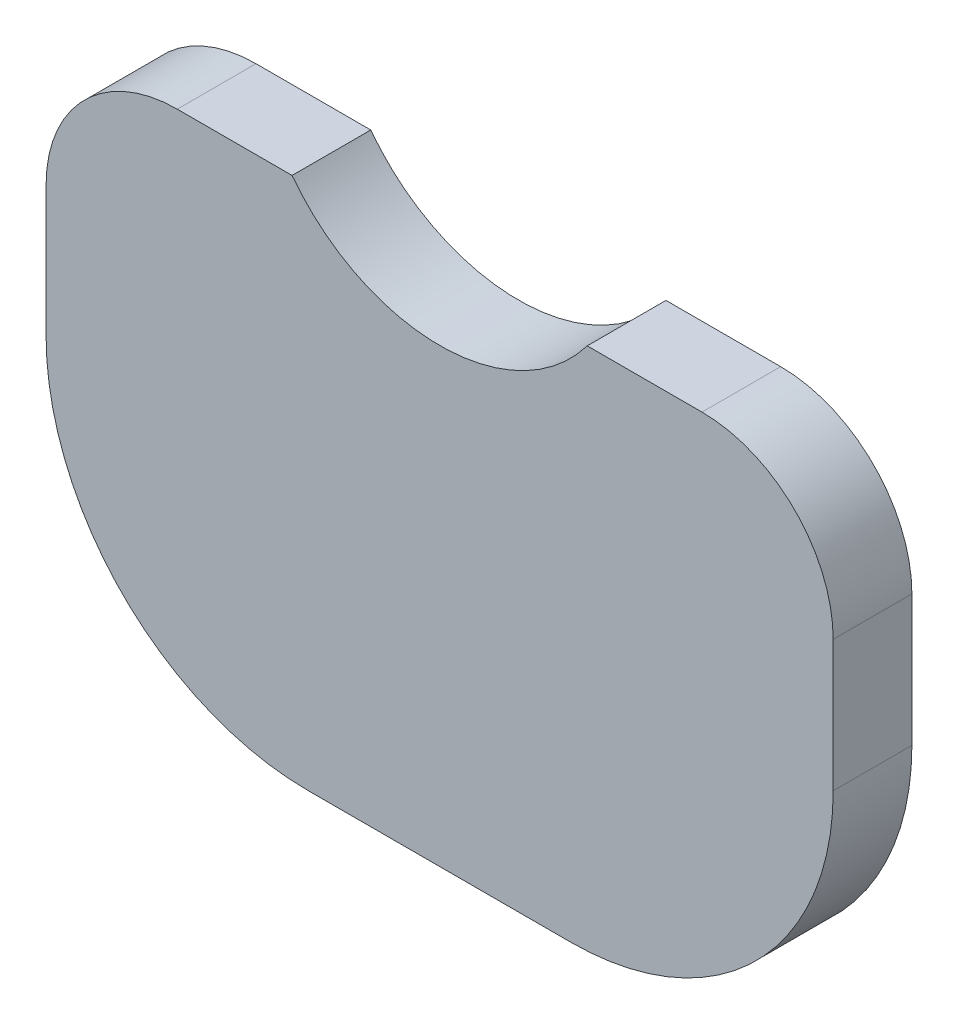
ISO-10303-21;
HEADER;
FILE_DESCRIPTION(('STEP AP214'),'2;1');
FILE_NAME('part.step','',(''),(''),'','','');
FILE_SCHEMA(('AUTOMOTIVE_DESIGN { 1 0 10303 214 1 1 1 1 }'));
ENDSEC;
DATA;
#1=APPLICATION_CONTEXT('core data for automotive mechanical design processes');
#2=APPLICATION_PROTOCOL_DEFINITION('international standard','automotive_design',2000,#1);
#3=PRODUCT_CONTEXT('',#1,'mechanical');
#4=PRODUCT('Part','Part','',(#3));
#5=PRODUCT_RELATED_PRODUCT_CATEGORY('part','',(#4));
#6=PRODUCT_DEFINITION_FORMATION('','',#4);
#7=PRODUCT_DEFINITION_CONTEXT('part definition',#1,'design');
#8=PRODUCT_DEFINITION('design','',#6,#7);
#9=PRODUCT_DEFINITION_SHAPE('','',#8);
#10=(LENGTH_UNIT() NAMED_UNIT(*) SI_UNIT(.MILLI.,.METRE.));
#11=(NAMED_UNIT(*) PLANE_ANGLE_UNIT() SI_UNIT($,.RADIAN.));
#12=(NAMED_UNIT(*) SI_UNIT($,.STERADIAN.) SOLID_ANGLE_UNIT());
#13=UNCERTAINTY_MEASURE_WITH_UNIT(LENGTH_MEASURE(1.E-05),#10,'distance_accuracy_value','');
#14=(GEOMETRIC_REPRESENTATION_CONTEXT(3) GLOBAL_UNCERTAINTY_ASSIGNED_CONTEXT((#13)) GLOBAL_UNIT_ASSIGNED_CONTEXT((#10,
#11,#12)) REPRESENTATION_CONTEXT('',''));
#15=CARTESIAN_POINT('',(0.,0.,0.));
#16=DIRECTION('',(0.,0.,1.));
#17=DIRECTION('',(1.,0.,0.));
#18=AXIS2_PLACEMENT_3D('',#15,#16,#17);
#19=CARTESIAN_POINT('',(-10.,0.,6.));
#20=DIRECTION('',(0.,0.,-1.));
#21=DIRECTION('',(-1.,0.,0.));
#22=AXIS2_PLACEMENT_3D('',#19,#20,#21);
#23=CYLINDRICAL_SURFACE('',#22,20.);
#24=CARTESIAN_POINT('',(-10.,0.,0.));
#25=DIRECTION('',(0.,0.,1.));
#26=DIRECTION('',(1.,0.,0.));
#27=AXIS2_PLACEMENT_3D('',#24,#25,#26);
#28=CIRCLE('',#27,20.);
#29=CARTESIAN_POINT('',(-9.99999999999986,-20.,0.));
#30=VERTEX_POINT('',#29);
#31=CARTESIAN_POINT('',(-30.,1.35308431126191E-13,0.));
#32=VERTEX_POINT('',#31);
#33=EDGE_CURVE('E155',#30,#32,#28,.F.);
#34=ORIENTED_EDGE('',*,*,#33,.F.);
#35=DIRECTION('',(0.,0.,-1.));
#36=VECTOR('',#35,1.);
#37=CARTESIAN_POINT('',(-9.99999999999986,-20.,6.));
#38=LINE('',#37,#36);
#39=CARTESIAN_POINT('',(-9.99999999999986,-20.,6.));
#40=VERTEX_POINT('',#39);
#41=EDGE_CURVE('E11',#40,#30,#38,.T.);
#42=ORIENTED_EDGE('',*,*,#41,.F.);
#43=CARTESIAN_POINT('',(-10.,0.,6.));
#44=DIRECTION('',(0.,0.,1.));
#45=DIRECTION('',(1.,0.,0.));
#46=AXIS2_PLACEMENT_3D('',#43,#44,#45);
#47=CIRCLE('',#46,20.);
#48=CARTESIAN_POINT('',(-30.,1.35308431126191E-13,6.));
#49=VERTEX_POINT('',#48);
#50=EDGE_CURVE('E188',#40,#49,#47,.F.);
#51=ORIENTED_EDGE('',*,*,#50,.T.);
#52=DIRECTION('',(0.,0.,-1.));
#53=VECTOR('',#52,1.);
#54=CARTESIAN_POINT('',(-30.,1.35308431126191E-13,6.));
#55=LINE('',#54,#53);
#56=EDGE_CURVE('E62',#49,#32,#55,.T.);
#57=ORIENTED_EDGE('',*,*,#56,.T.);
#58=EDGE_LOOP('',(#34,#42,#51,#57));
#59=FACE_BOUND('',#58,.T.);
#60=ADVANCED_FACE('F45',(#59),#23,.T.);
#61=CARTESIAN_POINT('',(0.,-20.,6.));
#62=DIRECTION('',(0.,-1.,0.));
#63=DIRECTION('',(1.,0.,0.));
#64=AXIS2_PLACEMENT_3D('',#61,#62,#63);
#65=PLANE('',#64);
#66=DIRECTION('',(-1.,0.,0.));
#67=VECTOR('',#66,1.);
#68=CARTESIAN_POINT('',(0.,-20.,0.));
#69=LINE('',#68,#67);
#70=CARTESIAN_POINT('',(9.99999999999986,-20.,0.));
#71=VERTEX_POINT('',#70);
#72=EDGE_CURVE('E158',#71,#30,#69,.T.);
#73=ORIENTED_EDGE('',*,*,#72,.F.);
#74=DIRECTION('',(0.,0.,-1.));
#75=VECTOR('',#74,1.);
#76=CARTESIAN_POINT('',(9.99999999999986,-20.,6.));
#77=LINE('',#76,#75);
#78=CARTESIAN_POINT('',(9.99999999999986,-20.,6.));
#79=VERTEX_POINT('',#78);
#80=EDGE_CURVE('E54',#79,#71,#77,.T.);
#81=ORIENTED_EDGE('',*,*,#80,.F.);
#82=DIRECTION('',(-1.,0.,0.));
#83=VECTOR('',#82,1.);
#84=CARTESIAN_POINT('',(0.,-20.,6.));
#85=LINE('',#84,#83);
#86=EDGE_CURVE('E244',#79,#40,#85,.T.);
#87=ORIENTED_EDGE('',*,*,#86,.T.);
#88=ORIENTED_EDGE('',*,*,#41,.T.);
#89=EDGE_LOOP('',(#73,#81,#87,#88));
#90=FACE_BOUND('',#89,.T.);
#91=ADVANCED_FACE('F219',(#90),#65,.T.);
#92=CARTESIAN_POINT('',(10.,0.,6.));
#93=DIRECTION('',(0.,0.,-1.));
#94=DIRECTION('',(-1.,0.,0.));
#95=AXIS2_PLACEMENT_3D('',#92,#93,#94);
#96=CYLINDRICAL_SURFACE('',#95,20.);
#97=CARTESIAN_POINT('',(10.,0.,0.));
#98=DIRECTION('',(0.,0.,1.));
#99=DIRECTION('',(1.,0.,0.));
#100=AXIS2_PLACEMENT_3D('',#97,#98,#99);
#101=CIRCLE('',#100,20.);
#102=CARTESIAN_POINT('',(30.,1.38777878078145E-13,0.));
#103=VERTEX_POINT('',#102);
#104=EDGE_CURVE('E163',#103,#71,#101,.F.);
#105=ORIENTED_EDGE('',*,*,#104,.F.);
#106=DIRECTION('',(0.,0.,-1.));
#107=VECTOR('',#106,1.);
#108=CARTESIAN_POINT('',(30.,1.38777878078145E-13,6.));
#109=LINE('',#108,#107);
#110=CARTESIAN_POINT('',(30.,1.38777878078145E-13,6.));
#111=VERTEX_POINT('',#110);
#112=EDGE_CURVE('E206',#111,#103,#109,.T.);
#113=ORIENTED_EDGE('',*,*,#112,.F.);
#114=CARTESIAN_POINT('',(10.,0.,6.));
#115=DIRECTION('',(0.,0.,1.));
#116=DIRECTION('',(1.,0.,0.));
#117=AXIS2_PLACEMENT_3D('',#114,#115,#116);
#118=CIRCLE('',#117,20.);
#119=EDGE_CURVE('E215',#111,#79,#118,.F.);
#120=ORIENTED_EDGE('',*,*,#119,.T.);
#121=ORIENTED_EDGE('',*,*,#80,.T.);
#122=EDGE_LOOP('',(#105,#113,#120,#121));
#123=FACE_BOUND('',#122,.T.);
#124=ADVANCED_FACE('F213',(#123),#96,.T.);
#125=CARTESIAN_POINT('',(30.,0.,6.));
#126=DIRECTION('',(-1.,0.,0.));
#127=DIRECTION('',(0.,0.,1.));
#128=AXIS2_PLACEMENT_3D('',#125,#126,#127);
#129=PLANE('',#128);
#130=DIRECTION('',(0.,1.,0.));
#131=VECTOR('',#130,1.);
#132=CARTESIAN_POINT('',(30.,0.,0.));
#133=LINE('',#132,#131);
#134=CARTESIAN_POINT('',(30.,9.99999999999993,0.));
#135=VERTEX_POINT('',#134);
#136=EDGE_CURVE('E167',#103,#135,#133,.T.);
#137=ORIENTED_EDGE('',*,*,#136,.T.);
#138=DIRECTION('',(0.,0.,-1.));
#139=VECTOR('',#138,1.);
#140=CARTESIAN_POINT('',(30.,9.99999999999993,6.));
#141=LINE('',#140,#139);
#142=CARTESIAN_POINT('',(30.,9.99999999999993,6.));
#143=VERTEX_POINT('',#142);
#144=EDGE_CURVE('E202',#143,#135,#141,.T.);
#145=ORIENTED_EDGE('',*,*,#144,.F.);
#146=DIRECTION('',(0.,1.,0.));
#147=VECTOR('',#146,1.);
#148=CARTESIAN_POINT('',(30.,0.,6.));
#149=LINE('',#148,#147);
#150=EDGE_CURVE('E236',#111,#143,#149,.T.);
#151=ORIENTED_EDGE('',*,*,#150,.F.);
#152=ORIENTED_EDGE('',*,*,#112,.T.);
#153=EDGE_LOOP('',(#137,#145,#151,#152));
#154=FACE_BOUND('',#153,.T.);
#155=ADVANCED_FACE('F227',(#154),#129,.F.);
#156=CARTESIAN_POINT('',(20.,10.,6.));
#157=DIRECTION('',(0.,0.,-1.));
#158=DIRECTION('',(-1.,0.,0.));
#159=AXIS2_PLACEMENT_3D('',#156,#157,#158);
#160=CYLINDRICAL_SURFACE('',#159,10.);
#161=CARTESIAN_POINT('',(20.,10.,0.));
#162=DIRECTION('',(0.,0.,1.));
#163=DIRECTION('',(1.,0.,0.));
#164=AXIS2_PLACEMENT_3D('',#161,#162,#163);
#165=CIRCLE('',#164,10.);
#166=CARTESIAN_POINT('',(19.9999999999999,20.,0.));
#167=VERTEX_POINT('',#166);
#168=EDGE_CURVE('E170',#135,#167,#165,.T.);
#169=ORIENTED_EDGE('',*,*,#168,.T.);
#170=DIRECTION('',(0.,0.,-1.));
#171=VECTOR('',#170,1.);
#172=CARTESIAN_POINT('',(19.9999999999999,20.,6.));
#173=LINE('',#172,#171);
#174=CARTESIAN_POINT('',(19.9999999999999,20.,6.));
#175=VERTEX_POINT('',#174);
#176=EDGE_CURVE('E198',#175,#167,#173,.T.);
#177=ORIENTED_EDGE('',*,*,#176,.F.);
#178=CARTESIAN_POINT('',(20.,10.,6.));
#179=DIRECTION('',(0.,0.,1.));
#180=DIRECTION('',(1.,0.,0.));
#181=AXIS2_PLACEMENT_3D('',#178,#179,#180);
#182=CIRCLE('',#181,10.);
#183=EDGE_CURVE('E233',#143,#175,#182,.T.);
#184=ORIENTED_EDGE('',*,*,#183,.F.);
#185=ORIENTED_EDGE('',*,*,#144,.T.);
#186=EDGE_LOOP('',(#169,#177,#184,#185));
#187=FACE_BOUND('',#186,.T.);
#188=ADVANCED_FACE('F231',(#187),#160,.T.);
#189=CARTESIAN_POINT('',(0.,20.,6.));
#190=DIRECTION('',(0.,-1.,0.));
#191=DIRECTION('',(1.,0.,0.));
#192=AXIS2_PLACEMENT_3D('',#189,#190,#191);
#193=PLANE('',#192);
#194=DIRECTION('',(-1.,0.,0.));
#195=VECTOR('',#194,1.);
#196=CARTESIAN_POINT('',(0.,20.,0.));
#197=LINE('',#196,#195);
#198=CARTESIAN_POINT('',(11.2498888883402,20.,0.));
#199=VERTEX_POINT('',#198);
#200=EDGE_CURVE('E173',#167,#199,#197,.T.);
#201=ORIENTED_EDGE('',*,*,#200,.T.);
#202=DIRECTION('',(0.,0.,-1.));
#203=VECTOR('',#202,1.);
#204=CARTESIAN_POINT('',(11.2498888883402,20.,6.));
#205=LINE('',#204,#203);
#206=CARTESIAN_POINT('',(11.2498888883402,20.,6.));
#207=VERTEX_POINT('',#206);
#208=EDGE_CURVE('E195',#207,#199,#205,.T.);
#209=ORIENTED_EDGE('',*,*,#208,.F.);
#210=DIRECTION('',(-1.,0.,0.));
#211=VECTOR('',#210,1.);
#212=CARTESIAN_POINT('',(0.,20.,6.));
#213=LINE('',#212,#211);
#214=EDGE_CURVE('E136',#175,#207,#213,.T.);
#215=ORIENTED_EDGE('',*,*,#214,.F.);
#216=ORIENTED_EDGE('',*,*,#176,.T.);
#217=EDGE_LOOP('',(#201,#209,#215,#216));
#218=FACE_BOUND('',#217,.T.);
#219=ADVANCED_FACE('F300',(#218),#193,.F.);
#220=CARTESIAN_POINT('',(0.,28.5,6.));
#221=DIRECTION('',(0.,0.,-1.));
#222=DIRECTION('',(-1.,0.,0.));
#223=AXIS2_PLACEMENT_3D('',#220,#221,#222);
#224=CYLINDRICAL_SURFACE('',#223,14.1);
#225=CARTESIAN_POINT('',(0.,28.5,0.));
#226=DIRECTION('',(0.,0.,1.));
#227=DIRECTION('',(1.,0.,0.));
#228=AXIS2_PLACEMENT_3D('',#225,#226,#227);
#229=CIRCLE('',#228,14.1);
#230=CARTESIAN_POINT('',(-11.2498888883402,20.,0.));
#231=VERTEX_POINT('',#230);
#232=EDGE_CURVE('E177',#231,#199,#229,.T.);
#233=ORIENTED_EDGE('',*,*,#232,.F.);
#234=DIRECTION('',(0.,0.,-1.));
#235=VECTOR('',#234,1.);
#236=CARTESIAN_POINT('',(-11.2498888883402,20.,6.));
#237=LINE('',#236,#235);
#238=CARTESIAN_POINT('',(-11.2498888883402,20.,6.));
#239=VERTEX_POINT('',#238);
#240=EDGE_CURVE('E145',#239,#231,#237,.T.);
#241=ORIENTED_EDGE('',*,*,#240,.F.);
#242=CARTESIAN_POINT('',(0.,28.5,6.));
#243=DIRECTION('',(0.,0.,1.));
#244=DIRECTION('',(1.,0.,0.));
#245=AXIS2_PLACEMENT_3D('',#242,#243,#244);
#246=CIRCLE('',#245,14.1);
#247=EDGE_CURVE('E132',#239,#207,#246,.T.);
#248=ORIENTED_EDGE('',*,*,#247,.T.);
#249=ORIENTED_EDGE('',*,*,#208,.T.);
#250=EDGE_LOOP('',(#233,#241,#248,#249));
#251=FACE_BOUND('',#250,.T.);
#252=ADVANCED_FACE('F299',(#251),#224,.F.);
#253=CARTESIAN_POINT('',(-19.9999999999999,20.,0.));
#254=VERTEX_POINT('',#253);
#255=EDGE_CURVE('E141',#231,#254,#197,.T.);
#256=ORIENTED_EDGE('',*,*,#255,.T.);
#257=DIRECTION('',(0.,0.,-1.));
#258=VECTOR('',#257,1.);
#259=CARTESIAN_POINT('',(-19.9999999999999,20.,6.));
#260=LINE('',#259,#258);
#261=CARTESIAN_POINT('',(-19.9999999999999,20.,6.));
#262=VERTEX_POINT('',#261);
#263=EDGE_CURVE('E138',#262,#254,#260,.T.);
#264=ORIENTED_EDGE('',*,*,#263,.F.);
#265=EDGE_CURVE('E125',#239,#262,#213,.T.);
#266=ORIENTED_EDGE('',*,*,#265,.F.);
#267=ORIENTED_EDGE('',*,*,#240,.T.);
#268=EDGE_LOOP('',(#256,#264,#266,#267));
#269=FACE_BOUND('',#268,.T.);
#270=ADVANCED_FACE('F139',(#269),#193,.F.);
#271=CARTESIAN_POINT('',(-20.,9.99999999999999,6.));
#272=DIRECTION('',(0.,0.,-1.));
#273=DIRECTION('',(-1.,0.,0.));
#274=AXIS2_PLACEMENT_3D('',#271,#272,#273);
#275=CYLINDRICAL_SURFACE('',#274,10.);
#276=CARTESIAN_POINT('',(-20.,9.99999999999999,0.));
#277=DIRECTION('',(0.,0.,1.));
#278=DIRECTION('',(1.,0.,0.));
#279=AXIS2_PLACEMENT_3D('',#276,#277,#278);
#280=CIRCLE('',#279,10.);
#281=CARTESIAN_POINT('',(-30.,9.99999999999992,0.));
#282=VERTEX_POINT('',#281);
#283=EDGE_CURVE('E181',#282,#254,#280,.F.);
#284=ORIENTED_EDGE('',*,*,#283,.F.);
#285=DIRECTION('',(0.,0.,-1.));
#286=VECTOR('',#285,1.);
#287=CARTESIAN_POINT('',(-30.,9.99999999999992,6.));
#288=LINE('',#287,#286);
#289=CARTESIAN_POINT('',(-30.,9.99999999999992,6.));
#290=VERTEX_POINT('',#289);
#291=EDGE_CURVE('E93',#290,#282,#288,.T.);
#292=ORIENTED_EDGE('',*,*,#291,.F.);
#293=CARTESIAN_POINT('',(-20.,9.99999999999999,6.));
#294=DIRECTION('',(0.,0.,1.));
#295=DIRECTION('',(1.,0.,0.));
#296=AXIS2_PLACEMENT_3D('',#293,#294,#295);
#297=CIRCLE('',#296,10.);
#298=EDGE_CURVE('E130',#290,#262,#297,.F.);
#299=ORIENTED_EDGE('',*,*,#298,.T.);
#300=ORIENTED_EDGE('',*,*,#263,.T.);
#301=EDGE_LOOP('',(#284,#292,#299,#300));
#302=FACE_BOUND('',#301,.T.);
#303=ADVANCED_FACE('F147',(#302),#275,.T.);
#304=CARTESIAN_POINT('',(-30.,0.,6.));
#305=DIRECTION('',(-1.,0.,0.));
#306=DIRECTION('',(0.,0.,1.));
#307=AXIS2_PLACEMENT_3D('',#304,#305,#306);
#308=PLANE('',#307);
#309=DIRECTION('',(0.,1.,0.));
#310=VECTOR('',#309,1.);
#311=CARTESIAN_POINT('',(-30.,0.,0.));
#312=LINE('',#311,#310);
#313=EDGE_CURVE('E184',#32,#282,#312,.T.);
#314=ORIENTED_EDGE('',*,*,#313,.F.);
#315=ORIENTED_EDGE('',*,*,#56,.F.);
#316=DIRECTION('',(0.,1.,0.));
#317=VECTOR('',#316,1.);
#318=CARTESIAN_POINT('',(-30.,0.,6.));
#319=LINE('',#318,#317);
#320=EDGE_CURVE('E149',#49,#290,#319,.T.);
#321=ORIENTED_EDGE('',*,*,#320,.T.);
#322=ORIENTED_EDGE('',*,*,#291,.T.);
#323=EDGE_LOOP('',(#314,#315,#321,#322));
#324=FACE_BOUND('',#323,.T.);
#325=ADVANCED_FACE('F286',(#324),#308,.T.);
#326=CARTESIAN_POINT('',(0.,0.,6.));
#327=DIRECTION('',(0.,0.,1.));
#328=DIRECTION('',(1.,0.,0.));
#329=AXIS2_PLACEMENT_3D('',#326,#327,#328);
#330=PLANE('',#329);
#331=ORIENTED_EDGE('',*,*,#50,.F.);
#332=ORIENTED_EDGE('',*,*,#86,.F.);
#333=ORIENTED_EDGE('',*,*,#119,.F.);
#334=ORIENTED_EDGE('',*,*,#150,.T.);
#335=ORIENTED_EDGE('',*,*,#183,.T.);
#336=ORIENTED_EDGE('',*,*,#214,.T.);
#337=ORIENTED_EDGE('',*,*,#247,.F.);
#338=ORIENTED_EDGE('',*,*,#265,.T.);
#339=ORIENTED_EDGE('',*,*,#298,.F.);
#340=ORIENTED_EDGE('',*,*,#320,.F.);
#341=EDGE_LOOP('',(#331,#332,#333,#334,#335,#336,#337,#338,#339,#340));
#342=FACE_BOUND('',#341,.T.);
#343=ADVANCED_FACE('F127',(#342),#330,.T.);
#344=CARTESIAN_POINT('',(0.,0.,0.));
#345=DIRECTION('',(0.,0.,1.));
#346=DIRECTION('',(1.,0.,0.));
#347=AXIS2_PLACEMENT_3D('',#344,#345,#346);
#348=PLANE('',#347);
#349=CARTESIAN_POINT('',(12.5,0.,0.));
#350=DIRECTION('',(0.,0.,1.));
#351=DIRECTION('',(1.,0.,0.));
#352=AXIS2_PLACEMENT_3D('',#349,#350,#351);
#353=CIRCLE('',#352,7.5);
#354=CARTESIAN_POINT('',(20.,0.,0.));
#355=VERTEX_POINT('',#354);
#356=EDGE_CURVE('E253',#355,#355,#353,.T.);
#357=ORIENTED_EDGE('',*,*,#356,.T.);
#358=EDGE_LOOP('',(#357));
#359=FACE_BOUND('',#358,.T.);
#360=CARTESIAN_POINT('',(-12.5,0.,0.));
#361=DIRECTION('',(0.,0.,1.));
#362=DIRECTION('',(1.,0.,0.));
#363=AXIS2_PLACEMENT_3D('',#360,#361,#362);
#364=CIRCLE('',#363,7.5);
#365=CARTESIAN_POINT('',(-5.,0.,0.));
#366=VERTEX_POINT('',#365);
#367=EDGE_CURVE('E249',#366,#366,#364,.T.);
#368=ORIENTED_EDGE('',*,*,#367,.T.);
#369=EDGE_LOOP('',(#368));
#370=FACE_BOUND('',#369,.T.);
#371=ORIENTED_EDGE('',*,*,#33,.T.);
#372=ORIENTED_EDGE('',*,*,#313,.T.);
#373=ORIENTED_EDGE('',*,*,#283,.T.);
#374=ORIENTED_EDGE('',*,*,#255,.F.);
#375=ORIENTED_EDGE('',*,*,#232,.T.);
#376=ORIENTED_EDGE('',*,*,#200,.F.);
#377=ORIENTED_EDGE('',*,*,#168,.F.);
#378=ORIENTED_EDGE('',*,*,#136,.F.);
#379=ORIENTED_EDGE('',*,*,#104,.T.);
#380=ORIENTED_EDGE('',*,*,#72,.T.);
#381=EDGE_LOOP('',(#371,#372,#373,#374,#375,#376,#377,#378,#379,#380));
#382=FACE_BOUND('',#381,.T.);
#383=ADVANCED_FACE('F222',(#359,#370,#382),#348,.F.);
#384=CARTESIAN_POINT('',(-12.5,0.,-6.5));
#385=DIRECTION('',(0.,0.,1.));
#386=DIRECTION('',(1.,0.,0.));
#387=AXIS2_PLACEMENT_3D('',#384,#385,#386);
#388=CYLINDRICAL_SURFACE('',#387,7.5);
#389=CARTESIAN_POINT('',(-12.5,0.,-6.5));
#390=DIRECTION('',(0.,0.,1.));
#391=DIRECTION('',(1.,0.,0.));
#392=AXIS2_PLACEMENT_3D('',#389,#390,#391);
#393=CIRCLE('',#392,7.5);
#394=CARTESIAN_POINT('',(-5.,0.,-6.5));
#395=VERTEX_POINT('',#394);
#396=EDGE_CURVE('E159',#395,#395,#393,.T.);
#397=CARTESIAN_POINT('',(-5.,0.,-6.5));
#398=CARTESIAN_POINT('',(-5.,0.,-6.43229166666667));
#399=CARTESIAN_POINT('',(-5.,0.,-6.36458333333333));
#400=CARTESIAN_POINT('',(-5.,0.,-6.22916666666667));
#401=CARTESIAN_POINT('',(-5.,0.,-6.16145833333333));
#402=CARTESIAN_POINT('',(-5.,0.,-6.02604166666667));
#403=CARTESIAN_POINT('',(-5.,0.,-5.95833333333333));
#404=CARTESIAN_POINT('',(-5.,0.,-5.82291666666667));
#405=CARTESIAN_POINT('',(-5.,0.,-5.75520833333333));
#406=CARTESIAN_POINT('',(-5.,0.,-5.61979166666667));
#407=CARTESIAN_POINT('',(-5.,0.,-5.55208333333333));
#408=CARTESIAN_POINT('',(-5.,0.,-5.41666666666667));
#409=CARTESIAN_POINT('',(-5.,0.,-5.34895833333333));
#410=CARTESIAN_POINT('',(-5.,0.,-5.21354166666667));
#411=CARTESIAN_POINT('',(-5.,0.,-5.14583333333333));
#412=CARTESIAN_POINT('',(-5.,0.,-5.01041666666667));
#413=CARTESIAN_POINT('',(-5.,0.,-4.94270833333333));
#414=CARTESIAN_POINT('',(-5.,0.,-4.80729166666667));
#415=CARTESIAN_POINT('',(-5.,0.,-4.73958333333333));
#416=CARTESIAN_POINT('',(-5.,0.,-4.60416666666667));
#417=CARTESIAN_POINT('',(-5.,0.,-4.53645833333333));
#418=CARTESIAN_POINT('',(-5.,0.,-4.40104166666667));
#419=CARTESIAN_POINT('',(-5.,0.,-4.33333333333333));
#420=CARTESIAN_POINT('',(-5.,0.,-4.19791666666667));
#421=CARTESIAN_POINT('',(-5.,0.,-4.13020833333333));
#422=CARTESIAN_POINT('',(-5.,0.,-3.99479166666667));
#423=CARTESIAN_POINT('',(-5.,0.,-3.92708333333333));
#424=CARTESIAN_POINT('',(-5.,0.,-3.79166666666667));
#425=CARTESIAN_POINT('',(-5.,0.,-3.72395833333333));
#426=CARTESIAN_POINT('',(-5.,0.,-3.58854166666667));
#427=CARTESIAN_POINT('',(-5.,0.,-3.52083333333333));
#428=CARTESIAN_POINT('',(-5.,0.,-3.38541666666667));
#429=CARTESIAN_POINT('',(-5.,0.,-3.31770833333333));
#430=CARTESIAN_POINT('',(-5.,0.,-3.18229166666667));
#431=CARTESIAN_POINT('',(-5.,0.,-3.11458333333333));
#432=CARTESIAN_POINT('',(-5.,0.,-2.97916666666667));
#433=CARTESIAN_POINT('',(-5.,0.,-2.91145833333333));
#434=CARTESIAN_POINT('',(-5.,0.,-2.77604166666667));
#435=CARTESIAN_POINT('',(-5.,0.,-2.70833333333333));
#436=CARTESIAN_POINT('',(-5.,0.,-2.57291666666667));
#437=CARTESIAN_POINT('',(-5.,0.,-2.50520833333333));
#438=CARTESIAN_POINT('',(-5.,0.,-2.36979166666667));
#439=CARTESIAN_POINT('',(-5.,0.,-2.30208333333333));
#440=CARTESIAN_POINT('',(-5.,0.,-2.16666666666667));
#441=CARTESIAN_POINT('',(-5.,0.,-2.09895833333333));
#442=CARTESIAN_POINT('',(-5.,0.,-1.96354166666667));
#443=CARTESIAN_POINT('',(-5.,0.,-1.89583333333333));
#444=CARTESIAN_POINT('',(-5.,0.,-1.76041666666667));
#445=CARTESIAN_POINT('',(-5.,0.,-1.69270833333333));
#446=CARTESIAN_POINT('',(-5.,0.,-1.55729166666667));
#447=CARTESIAN_POINT('',(-5.,0.,-1.48958333333333));
#448=CARTESIAN_POINT('',(-5.,0.,-1.35416666666667));
#449=CARTESIAN_POINT('',(-5.,0.,-1.28645833333333));
#450=CARTESIAN_POINT('',(-5.,0.,-1.15104166666667));
#451=CARTESIAN_POINT('',(-5.,0.,-1.08333333333333));
#452=CARTESIAN_POINT('',(-5.,0.,-0.947916666666667));
#453=CARTESIAN_POINT('',(-5.,0.,-0.880208333333333));
#454=CARTESIAN_POINT('',(-5.,0.,-0.744791666666667));
#455=CARTESIAN_POINT('',(-5.,0.,-0.677083333333333));
#456=CARTESIAN_POINT('',(-5.,0.,-0.541666666666667));
#457=CARTESIAN_POINT('',(-5.,0.,-0.473958333333333));
#458=CARTESIAN_POINT('',(-5.,0.,-0.338541666666667));
#459=CARTESIAN_POINT('',(-5.,0.,-0.270833333333334));
#460=CARTESIAN_POINT('',(-5.,0.,-0.135416666666667));
#461=CARTESIAN_POINT('',(-5.,0.,-0.0677083333333334));
#462=CARTESIAN_POINT('',(-5.,0.,0.));
#463=B_SPLINE_CURVE_WITH_KNOTS('',3,(#397,#398,#399,#400,#401,#402,#403,#404,#405,#406,#407,
#408,#409,#410,#411,#412,#413,#414,#415,#416,#417,#418,#419,#420,#421,#422,#423,#424,#425,#426,
#427,#428,#429,#430,#431,#432,#433,#434,#435,#436,#437,#438,#439,#440,#441,#442,#443,#444,#445,
#446,#447,#448,#449,#450,#451,#452,#453,#454,#455,#456,#457,#458,#459,#460,#461,#462),
.UNSPECIFIED.,.F.,.F.,(4,2,2,2,2,2,2,2,2,2,2,2,2,2,2,2,2,2,2,2,2,2,2,2,2,2,2,2,2,2,2,2,4),(0.,
0.203124999999999,0.40625,0.609375,0.8125,1.015625,1.21875,1.421875,1.625,1.828125,2.03125,
2.234375,2.4375,2.640625,2.84375,3.046875,3.25,3.453125,3.65625,3.859375,4.0625,4.265625,
4.46875,4.671875,4.875,5.078125,5.28125,5.484375,5.6875,5.890625,6.09375,6.296875,6.5),.UNSPECIFIED.);
#464=EDGE_CURVE('BSEAM279',#395,#366,#463,.T.);
#465=ORIENTED_EDGE('',*,*,#396,.T.);
#466=ORIENTED_EDGE('',*,*,#367,.F.);
#467=ORIENTED_EDGE('',*,*,#464,.T.);
#468=ORIENTED_EDGE('',*,*,#464,.F.);
#469=EDGE_LOOP('',(#465,#467,#466,#468));
#470=FACE_BOUND('',#469,.T.);
#471=ADVANCED_FACE('F279',(#470),#388,.T.);
#472=CARTESIAN_POINT('',(-12.5,0.,-6.5));
#473=DIRECTION('',(0.,0.,1.));
#474=DIRECTION('',(1.,0.,0.));
#475=AXIS2_PLACEMENT_3D('',#472,#473,#474);
#476=PLANE('',#475);
#477=ORIENTED_EDGE('',*,*,#396,.F.);
#478=EDGE_LOOP('',(#477));
#479=FACE_BOUND('',#478,.T.);
#480=ADVANCED_FACE('F270',(#479),#476,.F.);
#481=CARTESIAN_POINT('',(12.5,0.,-6.5));
#482=DIRECTION('',(0.,0.,1.));
#483=DIRECTION('',(1.,0.,0.));
#484=AXIS2_PLACEMENT_3D('',#481,#482,#483);
#485=CYLINDRICAL_SURFACE('',#484,7.5);
#486=CARTESIAN_POINT('',(12.5,0.,-6.5));
#487=DIRECTION('',(0.,0.,1.));
#488=DIRECTION('',(1.,0.,0.));
#489=AXIS2_PLACEMENT_3D('',#486,#487,#488);
#490=CIRCLE('',#489,7.5);
#491=CARTESIAN_POINT('',(20.,0.,-6.5));
#492=VERTEX_POINT('',#491);
#493=EDGE_CURVE('E257',#492,#492,#490,.T.);
#494=CARTESIAN_POINT('',(20.,0.,-6.5));
#495=CARTESIAN_POINT('',(20.,0.,-6.43229166666667));
#496=CARTESIAN_POINT('',(20.,0.,-6.36458333333333));
#497=CARTESIAN_POINT('',(20.,0.,-6.22916666666667));
#498=CARTESIAN_POINT('',(20.,0.,-6.16145833333333));
#499=CARTESIAN_POINT('',(20.,0.,-6.02604166666667));
#500=CARTESIAN_POINT('',(20.,0.,-5.95833333333333));
#501=CARTESIAN_POINT('',(20.,0.,-5.82291666666667));
#502=CARTESIAN_POINT('',(20.,0.,-5.75520833333333));
#503=CARTESIAN_POINT('',(20.,0.,-5.61979166666667));
#504=CARTESIAN_POINT('',(20.,0.,-5.55208333333333));
#505=CARTESIAN_POINT('',(20.,0.,-5.41666666666667));
#506=CARTESIAN_POINT('',(20.,0.,-5.34895833333333));
#507=CARTESIAN_POINT('',(20.,0.,-5.21354166666667));
#508=CARTESIAN_POINT('',(20.,0.,-5.14583333333333));
#509=CARTESIAN_POINT('',(20.,0.,-5.01041666666667));
#510=CARTESIAN_POINT('',(20.,0.,-4.94270833333333));
#511=CARTESIAN_POINT('',(20.,0.,-4.80729166666667));
#512=CARTESIAN_POINT('',(20.,0.,-4.73958333333333));
#513=CARTESIAN_POINT('',(20.,0.,-4.60416666666667));
#514=CARTESIAN_POINT('',(20.,0.,-4.53645833333333));
#515=CARTESIAN_POINT('',(20.,0.,-4.40104166666667));
#516=CARTESIAN_POINT('',(20.,0.,-4.33333333333333));
#517=CARTESIAN_POINT('',(20.,0.,-4.19791666666667));
#518=CARTESIAN_POINT('',(20.,0.,-4.13020833333333));
#519=CARTESIAN_POINT('',(20.,0.,-3.99479166666667));
#520=CARTESIAN_POINT('',(20.,0.,-3.92708333333333));
#521=CARTESIAN_POINT('',(20.,0.,-3.79166666666667));
#522=CARTESIAN_POINT('',(20.,0.,-3.72395833333333));
#523=CARTESIAN_POINT('',(20.,0.,-3.58854166666667));
#524=CARTESIAN_POINT('',(20.,0.,-3.52083333333333));
#525=CARTESIAN_POINT('',(20.,0.,-3.38541666666667));
#526=CARTESIAN_POINT('',(20.,0.,-3.31770833333333));
#527=CARTESIAN_POINT('',(20.,0.,-3.18229166666667));
#528=CARTESIAN_POINT('',(20.,0.,-3.11458333333333));
#529=CARTESIAN_POINT('',(20.,0.,-2.97916666666667));
#530=CARTESIAN_POINT('',(20.,0.,-2.91145833333333));
#531=CARTESIAN_POINT('',(20.,0.,-2.77604166666667));
#532=CARTESIAN_POINT('',(20.,0.,-2.70833333333333));
#533=CARTESIAN_POINT('',(20.,0.,-2.57291666666667));
#534=CARTESIAN_POINT('',(20.,0.,-2.50520833333333));
#535=CARTESIAN_POINT('',(20.,0.,-2.36979166666667));
#536=CARTESIAN_POINT('',(20.,0.,-2.30208333333333));
#537=CARTESIAN_POINT('',(20.,0.,-2.16666666666667));
#538=CARTESIAN_POINT('',(20.,0.,-2.09895833333333));
#539=CARTESIAN_POINT('',(20.,0.,-1.96354166666667));
#540=CARTESIAN_POINT('',(20.,0.,-1.89583333333333));
#541=CARTESIAN_POINT('',(20.,0.,-1.76041666666667));
#542=CARTESIAN_POINT('',(20.,0.,-1.69270833333333));
#543=CARTESIAN_POINT('',(20.,0.,-1.55729166666667));
#544=CARTESIAN_POINT('',(20.,0.,-1.48958333333333));
#545=CARTESIAN_POINT('',(20.,0.,-1.35416666666667));
#546=CARTESIAN_POINT('',(20.,0.,-1.28645833333333));
#547=CARTESIAN_POINT('',(20.,0.,-1.15104166666667));
#548=CARTESIAN_POINT('',(20.,0.,-1.08333333333333));
#549=CARTESIAN_POINT('',(20.,0.,-0.947916666666667));
#550=CARTESIAN_POINT('',(20.,0.,-0.880208333333333));
#551=CARTESIAN_POINT('',(20.,0.,-0.744791666666667));
#552=CARTESIAN_POINT('',(20.,0.,-0.677083333333333));
#553=CARTESIAN_POINT('',(20.,0.,-0.541666666666667));
#554=CARTESIAN_POINT('',(20.,0.,-0.473958333333333));
#555=CARTESIAN_POINT('',(20.,0.,-0.338541666666667));
#556=CARTESIAN_POINT('',(20.,0.,-0.270833333333334));
#557=CARTESIAN_POINT('',(20.,0.,-0.135416666666667));
#558=CARTESIAN_POINT('',(20.,0.,-0.0677083333333334));
#559=CARTESIAN_POINT('',(20.,0.,0.));
#560=B_SPLINE_CURVE_WITH_KNOTS('',3,(#494,#495,#496,#497,#498,#499,#500,#501,#502,#503,#504,
#505,#506,#507,#508,#509,#510,#511,#512,#513,#514,#515,#516,#517,#518,#519,#520,#521,#522,#523,
#524,#525,#526,#527,#528,#529,#530,#531,#532,#533,#534,#535,#536,#537,#538,#539,#540,#541,#542,
#543,#544,#545,#546,#547,#548,#549,#550,#551,#552,#553,#554,#555,#556,#557,#558,#559),
.UNSPECIFIED.,.F.,.F.,(4,2,2,2,2,2,2,2,2,2,2,2,2,2,2,2,2,2,2,2,2,2,2,2,2,2,2,2,2,2,2,2,4),(0.,
0.203124999999999,0.40625,0.609375,0.8125,1.015625,1.21875,1.421875,1.625,1.828125,2.03125,
2.234375,2.4375,2.640625,2.84375,3.046875,3.25,3.453125,3.65625,3.859375,4.0625,4.265625,
4.46875,4.671875,4.875,5.078125,5.28125,5.484375,5.6875,5.890625,6.09375,6.296875,6.5),.UNSPECIFIED.);
#561=EDGE_CURVE('BSEAM267',#492,#355,#560,.T.);
#562=ORIENTED_EDGE('',*,*,#493,.T.);
#563=ORIENTED_EDGE('',*,*,#356,.F.);
#564=ORIENTED_EDGE('',*,*,#561,.T.);
#565=ORIENTED_EDGE('',*,*,#561,.F.);
#566=EDGE_LOOP('',(#562,#564,#563,#565));
#567=FACE_BOUND('',#566,.T.);
#568=ADVANCED_FACE('F267',(#567),#485,.T.);
#569=CARTESIAN_POINT('',(12.5,0.,-6.5));
#570=DIRECTION('',(0.,0.,1.));
#571=DIRECTION('',(1.,0.,0.));
#572=AXIS2_PLACEMENT_3D('',#569,#570,#571);
#573=PLANE('',#572);
#574=ORIENTED_EDGE('',*,*,#493,.F.);
#575=EDGE_LOOP('',(#574));
#576=FACE_BOUND('',#575,.T.);
#577=ADVANCED_FACE('F269',(#576),#573,.F.);
#578=CLOSED_SHELL('',(#60,#91,#124,#155,#188,#219,#252,#270,#303,#325,#343,#383,#471,#480,#568,#577));
#579=MANIFOLD_SOLID_BREP('B2',#578);
#580=ADVANCED_BREP_SHAPE_REPRESENTATION('',(#18,#579),#14);
#581=SHAPE_DEFINITION_REPRESENTATION(#9,#580);
ENDSEC;
END-ISO-10303-21;
